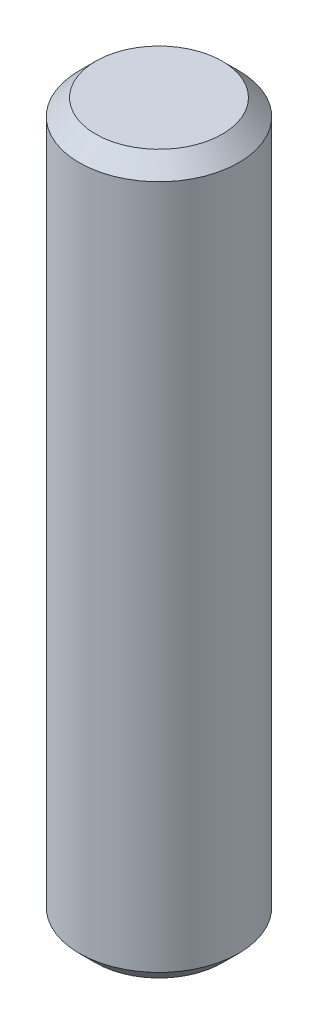
ISO-10303-21;
HEADER;
FILE_DESCRIPTION(('STEP AP214'),'2;1');
FILE_NAME('part.step','',(''),(''),'','','');
FILE_SCHEMA(('AUTOMOTIVE_DESIGN { 1 0 10303 214 1 1 1 1 }'));
ENDSEC;
DATA;
#1=APPLICATION_CONTEXT('core data for automotive mechanical design processes');
#2=APPLICATION_PROTOCOL_DEFINITION('international standard','automotive_design',2000,#1);
#3=PRODUCT_CONTEXT('',#1,'mechanical');
#4=PRODUCT('Part','Part','',(#3));
#5=PRODUCT_RELATED_PRODUCT_CATEGORY('part','',(#4));
#6=PRODUCT_DEFINITION_FORMATION('','',#4);
#7=PRODUCT_DEFINITION_CONTEXT('part definition',#1,'design');
#8=PRODUCT_DEFINITION('design','',#6,#7);
#9=PRODUCT_DEFINITION_SHAPE('','',#8);
#10=(LENGTH_UNIT() NAMED_UNIT(*) SI_UNIT(.MILLI.,.METRE.));
#11=(NAMED_UNIT(*) PLANE_ANGLE_UNIT() SI_UNIT($,.RADIAN.));
#12=(NAMED_UNIT(*) SI_UNIT($,.STERADIAN.) SOLID_ANGLE_UNIT());
#13=UNCERTAINTY_MEASURE_WITH_UNIT(LENGTH_MEASURE(1.E-05),#10,'distance_accuracy_value','');
#14=(GEOMETRIC_REPRESENTATION_CONTEXT(3) GLOBAL_UNCERTAINTY_ASSIGNED_CONTEXT((#13)) GLOBAL_UNIT_ASSIGNED_CONTEXT((#10,
#11,#12)) REPRESENTATION_CONTEXT('',''));
#15=CARTESIAN_POINT('',(0.,0.,0.));
#16=DIRECTION('',(0.,0.,1.));
#17=DIRECTION('',(1.,0.,0.));
#18=AXIS2_PLACEMENT_3D('',#15,#16,#17);
#19=CARTESIAN_POINT('',(0.,18.,0.));
#20=DIRECTION('',(0.,-1.,0.));
#21=DIRECTION('',(0.,0.,-1.));
#22=AXIS2_PLACEMENT_3D('',#19,#20,#21);
#23=CYLINDRICAL_SURFACE('',#22,2.);
#24=CARTESIAN_POINT('',(0.,0.413000000000004,0.));
#25=DIRECTION('',(0.,1.,0.));
#26=DIRECTION('',(0.,0.,1.));
#27=AXIS2_PLACEMENT_3D('',#24,#25,#26);
#28=CIRCLE('',#27,2.);
#29=CARTESIAN_POINT('',(0.,0.413000000000004,2.));
#30=VERTEX_POINT('',#29);
#31=EDGE_CURVE('E45',#30,#30,#28,.T.);
#32=ORIENTED_EDGE('',*,*,#31,.T.);
#33=EDGE_LOOP('',(#32));
#34=FACE_BOUND('',#33,.T.);
#35=CARTESIAN_POINT('',(0.,17.587,0.));
#36=DIRECTION('',(0.,1.,0.));
#37=DIRECTION('',(0.,0.,1.));
#38=AXIS2_PLACEMENT_3D('',#35,#36,#37);
#39=CIRCLE('',#38,2.);
#40=CARTESIAN_POINT('',(0.,17.587,2.));
#41=VERTEX_POINT('',#40);
#42=EDGE_CURVE('E49',#41,#41,#39,.F.);
#43=ORIENTED_EDGE('',*,*,#42,.T.);
#44=EDGE_LOOP('',(#43));
#45=FACE_BOUND('',#44,.T.);
#46=ADVANCED_FACE('F33',(#34,#45),#23,.T.);
#47=CARTESIAN_POINT('',(0.,18.,0.));
#48=DIRECTION('',(0.,1.,0.));
#49=DIRECTION('',(0.,0.,1.));
#50=AXIS2_PLACEMENT_3D('',#47,#48,#49);
#51=PLANE('',#50);
#52=CARTESIAN_POINT('',(0.,18.,0.));
#53=DIRECTION('',(0.,1.,0.));
#54=DIRECTION('',(0.,0.,1.));
#55=AXIS2_PLACEMENT_3D('',#52,#53,#54);
#56=CIRCLE('',#55,1.587);
#57=CARTESIAN_POINT('',(0.,18.,1.587));
#58=VERTEX_POINT('',#57);
#59=EDGE_CURVE('E10',#58,#58,#56,.T.);
#60=ORIENTED_EDGE('',*,*,#59,.T.);
#61=EDGE_LOOP('',(#60));
#62=FACE_BOUND('',#61,.T.);
#63=ADVANCED_FACE('F65',(#62),#51,.T.);
#64=CARTESIAN_POINT('',(0.,0.,0.));
#65=DIRECTION('',(0.,1.,0.));
#66=DIRECTION('',(0.,0.,1.));
#67=AXIS2_PLACEMENT_3D('',#64,#65,#66);
#68=PLANE('',#67);
#69=CARTESIAN_POINT('',(0.,0.,0.));
#70=DIRECTION('',(0.,1.,0.));
#71=DIRECTION('',(0.,0.,1.));
#72=AXIS2_PLACEMENT_3D('',#69,#70,#71);
#73=CIRCLE('',#72,1.58699999999999);
#74=CARTESIAN_POINT('',(0.,0.,1.58699999999999));
#75=VERTEX_POINT('',#74);
#76=EDGE_CURVE('E41',#75,#75,#73,.F.);
#77=ORIENTED_EDGE('',*,*,#76,.T.);
#78=EDGE_LOOP('',(#77));
#79=FACE_BOUND('',#78,.T.);
#80=ADVANCED_FACE('F62',(#79),#68,.F.);
#81=CARTESIAN_POINT('',(0.,0.413000000000004,0.));
#82=DIRECTION('',(0.,1.,0.));
#83=DIRECTION('',(0.,0.,1.));
#84=AXIS2_PLACEMENT_3D('',#81,#82,#83);
#85=CONICAL_SURFACE('',#84,2.,0.785398163397452);
#86=ORIENTED_EDGE('',*,*,#76,.F.);
#87=EDGE_LOOP('',(#86));
#88=FACE_BOUND('',#87,.T.);
#89=ORIENTED_EDGE('',*,*,#31,.F.);
#90=EDGE_LOOP('',(#89));
#91=FACE_BOUND('',#90,.T.);
#92=ADVANCED_FACE('F58',(#88,#91),#85,.T.);
#93=CARTESIAN_POINT('',(0.,18.,0.));
#94=DIRECTION('',(0.,-1.,0.));
#95=DIRECTION('',(0.,0.,-1.));
#96=AXIS2_PLACEMENT_3D('',#93,#94,#95);
#97=CONICAL_SURFACE('',#96,1.587,0.78539816339745);
#98=ORIENTED_EDGE('',*,*,#42,.F.);
#99=EDGE_LOOP('',(#98));
#100=FACE_BOUND('',#99,.T.);
#101=ORIENTED_EDGE('',*,*,#59,.F.);
#102=EDGE_LOOP('',(#101));
#103=FACE_BOUND('',#102,.T.);
#104=ADVANCED_FACE('F36',(#100,#103),#97,.T.);
#105=CLOSED_SHELL('',(#46,#63,#80,#92,#104));
#106=MANIFOLD_SOLID_BREP('B2',#105);
#107=ADVANCED_BREP_SHAPE_REPRESENTATION('',(#18,#106),#14);
#108=SHAPE_DEFINITION_REPRESENTATION(#9,#107);
ENDSEC;
END-ISO-10303-21;
